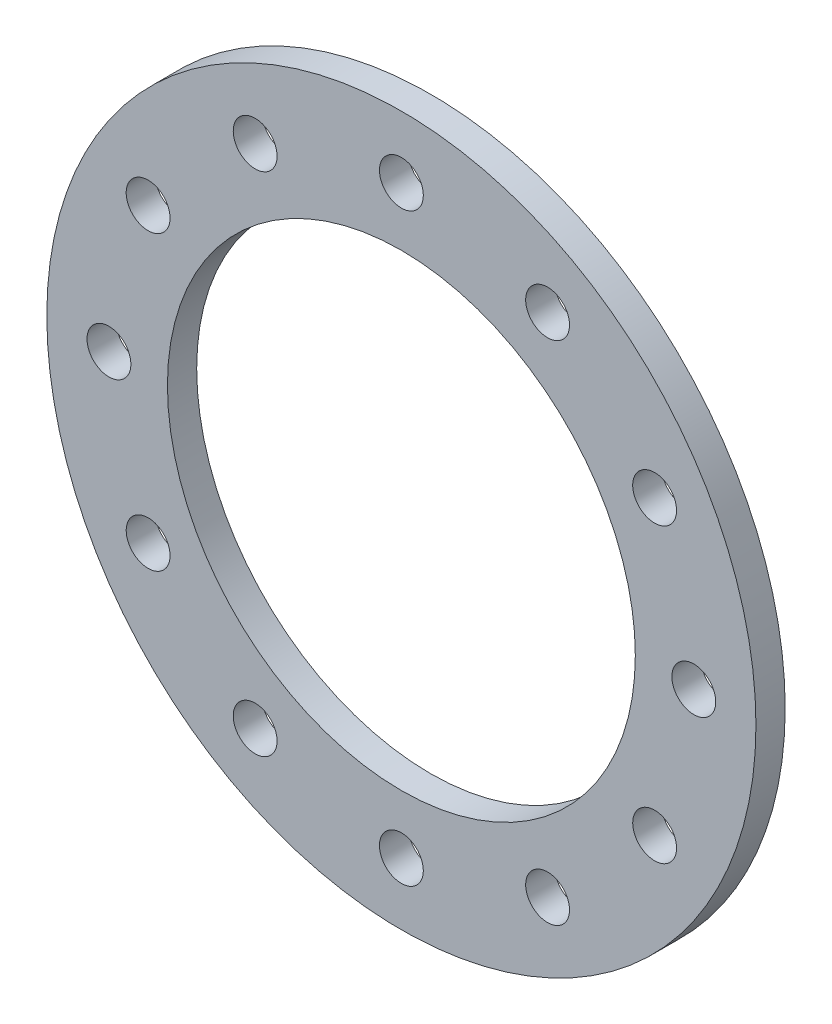
ISO-10303-21;
HEADER;
FILE_DESCRIPTION(('STEP AP214'),'2;1');
FILE_NAME('part.step','',(''),(''),'','','');
FILE_SCHEMA(('AUTOMOTIVE_DESIGN { 1 0 10303 214 1 1 1 1 }'));
ENDSEC;
DATA;
#1=APPLICATION_CONTEXT('core data for automotive mechanical design processes');
#2=APPLICATION_PROTOCOL_DEFINITION('international standard','automotive_design',2000,#1);
#3=PRODUCT_CONTEXT('',#1,'mechanical');
#4=PRODUCT('Part','Part','',(#3));
#5=PRODUCT_RELATED_PRODUCT_CATEGORY('part','',(#4));
#6=PRODUCT_DEFINITION_FORMATION('','',#4);
#7=PRODUCT_DEFINITION_CONTEXT('part definition',#1,'design');
#8=PRODUCT_DEFINITION('design','',#6,#7);
#9=PRODUCT_DEFINITION_SHAPE('','',#8);
#10=(LENGTH_UNIT() NAMED_UNIT(*) SI_UNIT(.MILLI.,.METRE.));
#11=(NAMED_UNIT(*) PLANE_ANGLE_UNIT() SI_UNIT($,.RADIAN.));
#12=(NAMED_UNIT(*) SI_UNIT($,.STERADIAN.) SOLID_ANGLE_UNIT());
#13=UNCERTAINTY_MEASURE_WITH_UNIT(LENGTH_MEASURE(1.E-05),#10,'distance_accuracy_value','');
#14=(GEOMETRIC_REPRESENTATION_CONTEXT(3) GLOBAL_UNCERTAINTY_ASSIGNED_CONTEXT((#13)) GLOBAL_UNIT_ASSIGNED_CONTEXT((#10,
#11,#12)) REPRESENTATION_CONTEXT('',''));
#15=CARTESIAN_POINT('',(0.,0.,0.));
#16=DIRECTION('',(0.,0.,1.));
#17=DIRECTION('',(1.,0.,0.));
#18=AXIS2_PLACEMENT_3D('',#15,#16,#17);
#19=CARTESIAN_POINT('',(0.,0.,4.));
#20=DIRECTION('',(0.,0.,1.));
#21=DIRECTION('',(1.,0.,0.));
#22=AXIS2_PLACEMENT_3D('',#19,#20,#21);
#23=PLANE('',#22);
#24=CARTESIAN_POINT('',(34.6410161513776,19.9999999999999,4.));
#25=DIRECTION('',(0.,0.,1.));
#26=DIRECTION('',(1.,0.,0.));
#27=AXIS2_PLACEMENT_3D('',#24,#25,#26);
#28=CIRCLE('',#27,3.);
#29=CARTESIAN_POINT('',(37.6410161513776,19.9999999999999,4.));
#30=VERTEX_POINT('',#29);
#31=EDGE_CURVE('E70',#30,#30,#28,.T.);
#32=ORIENTED_EDGE('',*,*,#31,.F.);
#33=EDGE_LOOP('',(#32));
#34=FACE_BOUND('',#33,.T.);
#35=CARTESIAN_POINT('',(40.,-1.39659253553725E-13,4.));
#36=DIRECTION('',(0.,0.,1.));
#37=DIRECTION('',(1.,0.,0.));
#38=AXIS2_PLACEMENT_3D('',#35,#36,#37);
#39=CIRCLE('',#38,3.);
#40=CARTESIAN_POINT('',(43.,-1.39659253553725E-13,4.));
#41=VERTEX_POINT('',#40);
#42=EDGE_CURVE('E74',#41,#41,#39,.T.);
#43=ORIENTED_EDGE('',*,*,#42,.F.);
#44=EDGE_LOOP('',(#43));
#45=FACE_BOUND('',#44,.T.);
#46=CARTESIAN_POINT('',(34.6410161513775,-20.0000000000002,4.));
#47=DIRECTION('',(0.,0.,1.));
#48=DIRECTION('',(1.,0.,0.));
#49=AXIS2_PLACEMENT_3D('',#46,#47,#48);
#50=CIRCLE('',#49,3.);
#51=CARTESIAN_POINT('',(37.6410161513775,-20.0000000000002,4.));
#52=VERTEX_POINT('',#51);
#53=EDGE_CURVE('E78',#52,#52,#50,.T.);
#54=ORIENTED_EDGE('',*,*,#53,.F.);
#55=EDGE_LOOP('',(#54));
#56=FACE_BOUND('',#55,.T.);
#57=CARTESIAN_POINT('',(19.9999999999998,-34.6410161513777,4.));
#58=DIRECTION('',(0.,0.,1.));
#59=DIRECTION('',(1.,0.,0.));
#60=AXIS2_PLACEMENT_3D('',#57,#58,#59);
#61=CIRCLE('',#60,3.);
#62=CARTESIAN_POINT('',(22.9999999999998,-34.6410161513777,4.));
#63=VERTEX_POINT('',#62);
#64=EDGE_CURVE('E82',#63,#63,#61,.T.);
#65=ORIENTED_EDGE('',*,*,#64,.F.);
#66=EDGE_LOOP('',(#65));
#67=FACE_BOUND('',#66,.T.);
#68=CARTESIAN_POINT('',(0.,-40.,4.));
#69=DIRECTION('',(0.,0.,1.));
#70=DIRECTION('',(1.,0.,0.));
#71=AXIS2_PLACEMENT_3D('',#68,#69,#70);
#72=CIRCLE('',#71,3.);
#73=CARTESIAN_POINT('',(3.,-40.,4.));
#74=VERTEX_POINT('',#73);
#75=EDGE_CURVE('E86',#74,#74,#72,.T.);
#76=ORIENTED_EDGE('',*,*,#75,.F.);
#77=EDGE_LOOP('',(#76));
#78=FACE_BOUND('',#77,.T.);
#79=CARTESIAN_POINT('',(-20.0000000000003,-34.6410161513774,4.));
#80=DIRECTION('',(0.,0.,1.));
#81=DIRECTION('',(1.,0.,0.));
#82=AXIS2_PLACEMENT_3D('',#79,#80,#81);
#83=CIRCLE('',#82,3.);
#84=CARTESIAN_POINT('',(-17.0000000000003,-34.6410161513774,4.));
#85=VERTEX_POINT('',#84);
#86=EDGE_CURVE('E90',#85,#85,#83,.T.);
#87=ORIENTED_EDGE('',*,*,#86,.F.);
#88=EDGE_LOOP('',(#87));
#89=FACE_BOUND('',#88,.T.);
#90=CARTESIAN_POINT('',(-34.6410161513777,-19.9999999999997,4.));
#91=DIRECTION('',(0.,0.,1.));
#92=DIRECTION('',(1.,0.,0.));
#93=AXIS2_PLACEMENT_3D('',#90,#91,#92);
#94=CIRCLE('',#93,3.);
#95=CARTESIAN_POINT('',(-31.6410161513777,-19.9999999999997,4.));
#96=VERTEX_POINT('',#95);
#97=EDGE_CURVE('E94',#96,#96,#94,.T.);
#98=ORIENTED_EDGE('',*,*,#97,.F.);
#99=EDGE_LOOP('',(#98));
#100=FACE_BOUND('',#99,.T.);
#101=CARTESIAN_POINT('',(-40.,4.18977760661176E-13,4.));
#102=DIRECTION('',(0.,0.,1.));
#103=DIRECTION('',(1.,0.,0.));
#104=AXIS2_PLACEMENT_3D('',#101,#102,#103);
#105=CIRCLE('',#104,3.);
#106=CARTESIAN_POINT('',(-37.,4.18977760661176E-13,4.));
#107=VERTEX_POINT('',#106);
#108=EDGE_CURVE('E98',#107,#107,#105,.T.);
#109=ORIENTED_EDGE('',*,*,#108,.F.);
#110=EDGE_LOOP('',(#109));
#111=FACE_BOUND('',#110,.T.);
#112=CARTESIAN_POINT('',(-34.6410161513773,20.0000000000004,4.));
#113=DIRECTION('',(0.,0.,1.));
#114=DIRECTION('',(1.,0.,0.));
#115=AXIS2_PLACEMENT_3D('',#112,#113,#114);
#116=CIRCLE('',#115,3.);
#117=CARTESIAN_POINT('',(-31.6410161513773,20.0000000000004,4.));
#118=VERTEX_POINT('',#117);
#119=EDGE_CURVE('E102',#118,#118,#116,.T.);
#120=ORIENTED_EDGE('',*,*,#119,.F.);
#121=EDGE_LOOP('',(#120));
#122=FACE_BOUND('',#121,.T.);
#123=CARTESIAN_POINT('',(-19.9999999999996,34.6410161513778,4.));
#124=DIRECTION('',(0.,0.,1.));
#125=DIRECTION('',(1.,0.,0.));
#126=AXIS2_PLACEMENT_3D('',#123,#124,#125);
#127=CIRCLE('',#126,3.);
#128=CARTESIAN_POINT('',(-16.9999999999996,34.6410161513778,4.));
#129=VERTEX_POINT('',#128);
#130=EDGE_CURVE('E106',#129,#129,#127,.T.);
#131=ORIENTED_EDGE('',*,*,#130,.F.);
#132=EDGE_LOOP('',(#131));
#133=FACE_BOUND('',#132,.T.);
#134=CARTESIAN_POINT('',(20.,34.6410161513775,4.));
#135=DIRECTION('',(0.,0.,1.));
#136=DIRECTION('',(1.,0.,0.));
#137=AXIS2_PLACEMENT_3D('',#134,#135,#136);
#138=CIRCLE('',#137,3.);
#139=CARTESIAN_POINT('',(23.,34.6410161513775,4.));
#140=VERTEX_POINT('',#139);
#141=EDGE_CURVE('E110',#140,#140,#138,.T.);
#142=ORIENTED_EDGE('',*,*,#141,.F.);
#143=EDGE_LOOP('',(#142));
#144=FACE_BOUND('',#143,.T.);
#145=CARTESIAN_POINT('',(0.,40.,4.));
#146=DIRECTION('',(0.,0.,1.));
#147=DIRECTION('',(1.,0.,0.));
#148=AXIS2_PLACEMENT_3D('',#145,#146,#147);
#149=CIRCLE('',#148,3.);
#150=CARTESIAN_POINT('',(3.,40.,4.));
#151=VERTEX_POINT('',#150);
#152=EDGE_CURVE('E59',#151,#151,#149,.T.);
#153=ORIENTED_EDGE('',*,*,#152,.F.);
#154=EDGE_LOOP('',(#153));
#155=FACE_BOUND('',#154,.T.);
#156=CARTESIAN_POINT('',(0.,0.,4.));
#157=DIRECTION('',(0.,0.,1.));
#158=DIRECTION('',(1.,0.,0.));
#159=AXIS2_PLACEMENT_3D('',#156,#157,#158);
#160=CIRCLE('',#159,48.5);
#161=CARTESIAN_POINT('',(48.5,0.,4.));
#162=VERTEX_POINT('',#161);
#163=EDGE_CURVE('E10',#162,#162,#160,.T.);
#164=ORIENTED_EDGE('',*,*,#163,.T.);
#165=EDGE_LOOP('',(#164));
#166=FACE_BOUND('',#165,.T.);
#167=CARTESIAN_POINT('',(0.,0.,4.));
#168=DIRECTION('',(0.,0.,1.));
#169=DIRECTION('',(1.,0.,0.));
#170=AXIS2_PLACEMENT_3D('',#167,#168,#169);
#171=CIRCLE('',#170,32.);
#172=CARTESIAN_POINT('',(32.,0.,4.));
#173=VERTEX_POINT('',#172);
#174=EDGE_CURVE('E53',#173,#173,#171,.T.);
#175=ORIENTED_EDGE('',*,*,#174,.F.);
#176=EDGE_LOOP('',(#175));
#177=FACE_BOUND('',#176,.T.);
#178=ADVANCED_FACE('F40',(#34,#45,#56,#67,#78,#89,#100,#111,#122,#133,#144,#155,#166,#177),#23,.T.);
#179=CARTESIAN_POINT('',(0.,0.,0.));
#180=DIRECTION('',(0.,0.,1.));
#181=DIRECTION('',(1.,0.,0.));
#182=AXIS2_PLACEMENT_3D('',#179,#180,#181);
#183=PLANE('',#182);
#184=CARTESIAN_POINT('',(34.6410161513776,19.9999999999999,0.));
#185=DIRECTION('',(0.,0.,-1.));
#186=DIRECTION('',(-0.499999999999998,0.86602540378444,0.));
#187=AXIS2_PLACEMENT_3D('',#184,#185,#186);
#188=CIRCLE('',#187,3.);
#189=CARTESIAN_POINT('',(33.1410161513776,22.5980762113532,0.));
#190=VERTEX_POINT('',#189);
#191=EDGE_CURVE('E118',#190,#190,#188,.T.);
#192=ORIENTED_EDGE('',*,*,#191,.F.);
#193=EDGE_LOOP('',(#192));
#194=FACE_BOUND('',#193,.T.);
#195=CARTESIAN_POINT('',(40.,-1.39659253553725E-13,0.));
#196=DIRECTION('',(0.,0.,-1.));
#197=DIRECTION('',(0.,1.,0.));
#198=AXIS2_PLACEMENT_3D('',#195,#196,#197);
#199=CIRCLE('',#198,3.);
#200=CARTESIAN_POINT('',(40.,2.99999999999986,0.));
#201=VERTEX_POINT('',#200);
#202=EDGE_CURVE('E144',#201,#201,#199,.T.);
#203=ORIENTED_EDGE('',*,*,#202,.F.);
#204=EDGE_LOOP('',(#203));
#205=FACE_BOUND('',#204,.T.);
#206=CARTESIAN_POINT('',(34.6410161513775,-20.0000000000002,0.));
#207=DIRECTION('',(0.,0.,-1.));
#208=DIRECTION('',(0.500000000000004,0.866025403784436,0.));
#209=AXIS2_PLACEMENT_3D('',#206,#207,#208);
#210=CIRCLE('',#209,3.);
#211=CARTESIAN_POINT('',(36.1410161513775,-17.4019237886469,0.));
#212=VERTEX_POINT('',#211);
#213=EDGE_CURVE('E140',#212,#212,#210,.T.);
#214=ORIENTED_EDGE('',*,*,#213,.F.);
#215=EDGE_LOOP('',(#214));
#216=FACE_BOUND('',#215,.T.);
#217=CARTESIAN_POINT('',(19.9999999999998,-34.6410161513777,0.));
#218=DIRECTION('',(0.,0.,-1.));
#219=DIRECTION('',(0.866025403784442,0.499999999999995,0.));
#220=AXIS2_PLACEMENT_3D('',#217,#218,#219);
#221=CIRCLE('',#220,3.);
#222=CARTESIAN_POINT('',(22.5980762113531,-33.1410161513777,0.));
#223=VERTEX_POINT('',#222);
#224=EDGE_CURVE('E136',#223,#223,#221,.T.);
#225=ORIENTED_EDGE('',*,*,#224,.F.);
#226=EDGE_LOOP('',(#225));
#227=FACE_BOUND('',#226,.T.);
#228=CARTESIAN_POINT('',(0.,-40.,0.));
#229=DIRECTION('',(0.,0.,-1.));
#230=DIRECTION('',(1.,0.,0.));
#231=AXIS2_PLACEMENT_3D('',#228,#229,#230);
#232=CIRCLE('',#231,3.);
#233=CARTESIAN_POINT('',(3.,-40.,0.));
#234=VERTEX_POINT('',#233);
#235=EDGE_CURVE('E132',#234,#234,#232,.T.);
#236=ORIENTED_EDGE('',*,*,#235,.F.);
#237=EDGE_LOOP('',(#236));
#238=FACE_BOUND('',#237,.T.);
#239=CARTESIAN_POINT('',(-20.0000000000003,-34.6410161513774,0.));
#240=DIRECTION('',(0.,0.,-1.));
#241=DIRECTION('',(0.866025403784435,-0.500000000000007,0.));
#242=AXIS2_PLACEMENT_3D('',#239,#240,#241);
#243=CIRCLE('',#242,3.);
#244=CARTESIAN_POINT('',(-17.401923788647,-36.1410161513774,0.));
#245=VERTEX_POINT('',#244);
#246=EDGE_CURVE('E128',#245,#245,#243,.T.);
#247=ORIENTED_EDGE('',*,*,#246,.F.);
#248=EDGE_LOOP('',(#247));
#249=FACE_BOUND('',#248,.T.);
#250=CARTESIAN_POINT('',(-34.6410161513777,-19.9999999999997,0.));
#251=DIRECTION('',(0.,0.,-1.));
#252=DIRECTION('',(0.499999999999992,-0.866025403784443,0.));
#253=AXIS2_PLACEMENT_3D('',#250,#251,#252);
#254=CIRCLE('',#253,3.);
#255=CARTESIAN_POINT('',(-33.1410161513778,-22.598076211353,0.));
#256=VERTEX_POINT('',#255);
#257=EDGE_CURVE('E123',#256,#256,#254,.T.);
#258=ORIENTED_EDGE('',*,*,#257,.F.);
#259=EDGE_LOOP('',(#258));
#260=FACE_BOUND('',#259,.T.);
#261=CARTESIAN_POINT('',(-40.,4.18977760661176E-13,0.));
#262=DIRECTION('',(0.,0.,-1.));
#263=DIRECTION('',(0.,-1.,0.));
#264=AXIS2_PLACEMENT_3D('',#261,#262,#263);
#265=CIRCLE('',#264,3.);
#266=CARTESIAN_POINT('',(-40.,-2.99999999999958,0.));
#267=VERTEX_POINT('',#266);
#268=EDGE_CURVE('E119',#267,#267,#265,.T.);
#269=ORIENTED_EDGE('',*,*,#268,.F.);
#270=EDGE_LOOP('',(#269));
#271=FACE_BOUND('',#270,.T.);
#272=CARTESIAN_POINT('',(-34.6410161513773,20.0000000000004,0.));
#273=DIRECTION('',(0.,0.,-1.));
#274=DIRECTION('',(-0.50000000000001,-0.866025403784433,0.));
#275=AXIS2_PLACEMENT_3D('',#272,#273,#274);
#276=CIRCLE('',#275,3.);
#277=CARTESIAN_POINT('',(-36.1410161513773,17.4019237886471,0.));
#278=VERTEX_POINT('',#277);
#279=EDGE_CURVE('E124',#278,#278,#276,.T.);
#280=ORIENTED_EDGE('',*,*,#279,.F.);
#281=EDGE_LOOP('',(#280));
#282=FACE_BOUND('',#281,.T.);
#283=CARTESIAN_POINT('',(-19.9999999999996,34.6410161513778,0.));
#284=DIRECTION('',(0.,0.,-1.));
#285=DIRECTION('',(-0.866025403784445,-0.499999999999989,0.));
#286=AXIS2_PLACEMENT_3D('',#283,#284,#285);
#287=CIRCLE('',#286,3.);
#288=CARTESIAN_POINT('',(-22.5980762113529,33.1410161513778,0.));
#289=VERTEX_POINT('',#288);
#290=EDGE_CURVE('E151',#289,#289,#287,.T.);
#291=ORIENTED_EDGE('',*,*,#290,.F.);
#292=EDGE_LOOP('',(#291));
#293=FACE_BOUND('',#292,.T.);
#294=CARTESIAN_POINT('',(20.,34.6410161513775,0.));
#295=DIRECTION('',(0.,0.,-1.));
#296=DIRECTION('',(-0.866025403784438,0.500000000000001,0.));
#297=AXIS2_PLACEMENT_3D('',#294,#295,#296);
#298=CIRCLE('',#297,3.);
#299=CARTESIAN_POINT('',(17.4019237886467,36.1410161513775,0.));
#300=VERTEX_POINT('',#299);
#301=EDGE_CURVE('E114',#300,#300,#298,.T.);
#302=ORIENTED_EDGE('',*,*,#301,.F.);
#303=EDGE_LOOP('',(#302));
#304=FACE_BOUND('',#303,.T.);
#305=CARTESIAN_POINT('',(0.,40.,0.));
#306=DIRECTION('',(0.,0.,-1.));
#307=DIRECTION('',(-1.,0.,0.));
#308=AXIS2_PLACEMENT_3D('',#305,#306,#307);
#309=CIRCLE('',#308,3.);
#310=CARTESIAN_POINT('',(-3.,40.,0.));
#311=VERTEX_POINT('',#310);
#312=EDGE_CURVE('E66',#311,#311,#309,.T.);
#313=ORIENTED_EDGE('',*,*,#312,.F.);
#314=EDGE_LOOP('',(#313));
#315=FACE_BOUND('',#314,.T.);
#316=CARTESIAN_POINT('',(0.,0.,0.));
#317=DIRECTION('',(0.,0.,1.));
#318=DIRECTION('',(1.,0.,0.));
#319=AXIS2_PLACEMENT_3D('',#316,#317,#318);
#320=CIRCLE('',#319,48.5);
#321=CARTESIAN_POINT('',(48.5,0.,0.));
#322=VERTEX_POINT('',#321);
#323=EDGE_CURVE('E44',#322,#322,#320,.T.);
#324=ORIENTED_EDGE('',*,*,#323,.F.);
#325=EDGE_LOOP('',(#324));
#326=FACE_BOUND('',#325,.T.);
#327=CARTESIAN_POINT('',(0.,0.,0.));
#328=DIRECTION('',(0.,0.,1.));
#329=DIRECTION('',(1.,0.,0.));
#330=AXIS2_PLACEMENT_3D('',#327,#328,#329);
#331=CIRCLE('',#330,32.);
#332=CARTESIAN_POINT('',(32.,0.,0.));
#333=VERTEX_POINT('',#332);
#334=EDGE_CURVE('E55',#333,#333,#331,.T.);
#335=ORIENTED_EDGE('',*,*,#334,.T.);
#336=EDGE_LOOP('',(#335));
#337=FACE_BOUND('',#336,.T.);
#338=ADVANCED_FACE('F161',(#194,#205,#216,#227,#238,#249,#260,#271,#282,#293,#304,#315,#326,
#337),#183,.F.);
#339=CARTESIAN_POINT('',(0.,0.,4.));
#340=DIRECTION('',(0.,0.,-1.));
#341=DIRECTION('',(-1.,0.,0.));
#342=AXIS2_PLACEMENT_3D('',#339,#340,#341);
#343=CYLINDRICAL_SURFACE('',#342,48.5);
#344=ORIENTED_EDGE('',*,*,#163,.F.);
#345=EDGE_LOOP('',(#344));
#346=FACE_BOUND('',#345,.T.);
#347=ORIENTED_EDGE('',*,*,#323,.T.);
#348=EDGE_LOOP('',(#347));
#349=FACE_BOUND('',#348,.T.);
#350=ADVANCED_FACE('F42',(#346,#349),#343,.T.);
#351=CARTESIAN_POINT('',(0.,0.,4.));
#352=DIRECTION('',(0.,0.,-1.));
#353=DIRECTION('',(-1.,0.,0.));
#354=AXIS2_PLACEMENT_3D('',#351,#352,#353);
#355=CYLINDRICAL_SURFACE('',#354,32.);
#356=ORIENTED_EDGE('',*,*,#174,.T.);
#357=EDGE_LOOP('',(#356));
#358=FACE_BOUND('',#357,.T.);
#359=ORIENTED_EDGE('',*,*,#334,.F.);
#360=EDGE_LOOP('',(#359));
#361=FACE_BOUND('',#360,.T.);
#362=ADVANCED_FACE('F175',(#358,#361),#355,.F.);
#363=CARTESIAN_POINT('',(0.,40.,18.6));
#364=DIRECTION('',(0.,0.,-1.));
#365=DIRECTION('',(-1.,0.,0.));
#366=AXIS2_PLACEMENT_3D('',#363,#364,#365);
#367=CYLINDRICAL_SURFACE('',#366,3.);
#368=ORIENTED_EDGE('',*,*,#152,.T.);
#369=EDGE_LOOP('',(#368));
#370=FACE_BOUND('',#369,.T.);
#371=ORIENTED_EDGE('',*,*,#312,.T.);
#372=EDGE_LOOP('',(#371));
#373=FACE_BOUND('',#372,.T.);
#374=ADVANCED_FACE('F177',(#370,#373),#367,.F.);
#375=CARTESIAN_POINT('',(20.,34.6410161513775,18.6));
#376=DIRECTION('',(0.,0.,-1.));
#377=DIRECTION('',(-1.,0.,0.));
#378=AXIS2_PLACEMENT_3D('',#375,#376,#377);
#379=CYLINDRICAL_SURFACE('',#378,3.);
#380=ORIENTED_EDGE('',*,*,#141,.T.);
#381=EDGE_LOOP('',(#380));
#382=FACE_BOUND('',#381,.T.);
#383=ORIENTED_EDGE('',*,*,#301,.T.);
#384=EDGE_LOOP('',(#383));
#385=FACE_BOUND('',#384,.T.);
#386=ADVANCED_FACE('F184',(#382,#385),#379,.F.);
#387=CARTESIAN_POINT('',(-19.9999999999996,34.6410161513778,18.6));
#388=DIRECTION('',(0.,0.,-1.));
#389=DIRECTION('',(-1.,0.,0.));
#390=AXIS2_PLACEMENT_3D('',#387,#388,#389);
#391=CYLINDRICAL_SURFACE('',#390,3.);
#392=ORIENTED_EDGE('',*,*,#130,.T.);
#393=EDGE_LOOP('',(#392));
#394=FACE_BOUND('',#393,.T.);
#395=ORIENTED_EDGE('',*,*,#290,.T.);
#396=EDGE_LOOP('',(#395));
#397=FACE_BOUND('',#396,.T.);
#398=ADVANCED_FACE('F223',(#394,#397),#391,.F.);
#399=CARTESIAN_POINT('',(-34.6410161513773,20.0000000000004,18.6));
#400=DIRECTION('',(0.,0.,-1.));
#401=DIRECTION('',(-1.,0.,0.));
#402=AXIS2_PLACEMENT_3D('',#399,#400,#401);
#403=CYLINDRICAL_SURFACE('',#402,3.);
#404=ORIENTED_EDGE('',*,*,#119,.T.);
#405=EDGE_LOOP('',(#404));
#406=FACE_BOUND('',#405,.T.);
#407=ORIENTED_EDGE('',*,*,#279,.T.);
#408=EDGE_LOOP('',(#407));
#409=FACE_BOUND('',#408,.T.);
#410=ADVANCED_FACE('F159',(#406,#409),#403,.F.);
#411=CARTESIAN_POINT('',(-40.,4.18977760661176E-13,18.6));
#412=DIRECTION('',(0.,0.,-1.));
#413=DIRECTION('',(-1.,0.,0.));
#414=AXIS2_PLACEMENT_3D('',#411,#412,#413);
#415=CYLINDRICAL_SURFACE('',#414,3.);
#416=ORIENTED_EDGE('',*,*,#108,.T.);
#417=EDGE_LOOP('',(#416));
#418=FACE_BOUND('',#417,.T.);
#419=ORIENTED_EDGE('',*,*,#268,.T.);
#420=EDGE_LOOP('',(#419));
#421=FACE_BOUND('',#420,.T.);
#422=ADVANCED_FACE('F231',(#418,#421),#415,.F.);
#423=CARTESIAN_POINT('',(-34.6410161513777,-19.9999999999997,18.6));
#424=DIRECTION('',(0.,0.,-1.));
#425=DIRECTION('',(-1.,0.,0.));
#426=AXIS2_PLACEMENT_3D('',#423,#424,#425);
#427=CYLINDRICAL_SURFACE('',#426,3.);
#428=ORIENTED_EDGE('',*,*,#97,.T.);
#429=EDGE_LOOP('',(#428));
#430=FACE_BOUND('',#429,.T.);
#431=ORIENTED_EDGE('',*,*,#257,.T.);
#432=EDGE_LOOP('',(#431));
#433=FACE_BOUND('',#432,.T.);
#434=ADVANCED_FACE('F234',(#430,#433),#427,.F.);
#435=CARTESIAN_POINT('',(-20.0000000000003,-34.6410161513774,18.6));
#436=DIRECTION('',(0.,0.,-1.));
#437=DIRECTION('',(-1.,0.,0.));
#438=AXIS2_PLACEMENT_3D('',#435,#436,#437);
#439=CYLINDRICAL_SURFACE('',#438,3.);
#440=ORIENTED_EDGE('',*,*,#86,.T.);
#441=EDGE_LOOP('',(#440));
#442=FACE_BOUND('',#441,.T.);
#443=ORIENTED_EDGE('',*,*,#246,.T.);
#444=EDGE_LOOP('',(#443));
#445=FACE_BOUND('',#444,.T.);
#446=ADVANCED_FACE('F238',(#442,#445),#439,.F.);
#447=CARTESIAN_POINT('',(0.,-40.,18.6));
#448=DIRECTION('',(0.,0.,-1.));
#449=DIRECTION('',(-1.,0.,0.));
#450=AXIS2_PLACEMENT_3D('',#447,#448,#449);
#451=CYLINDRICAL_SURFACE('',#450,3.);
#452=ORIENTED_EDGE('',*,*,#75,.T.);
#453=EDGE_LOOP('',(#452));
#454=FACE_BOUND('',#453,.T.);
#455=ORIENTED_EDGE('',*,*,#235,.T.);
#456=EDGE_LOOP('',(#455));
#457=FACE_BOUND('',#456,.T.);
#458=ADVANCED_FACE('F242',(#454,#457),#451,.F.);
#459=CARTESIAN_POINT('',(19.9999999999998,-34.6410161513777,18.6));
#460=DIRECTION('',(0.,0.,-1.));
#461=DIRECTION('',(-1.,0.,0.));
#462=AXIS2_PLACEMENT_3D('',#459,#460,#461);
#463=CYLINDRICAL_SURFACE('',#462,3.);
#464=ORIENTED_EDGE('',*,*,#64,.T.);
#465=EDGE_LOOP('',(#464));
#466=FACE_BOUND('',#465,.T.);
#467=ORIENTED_EDGE('',*,*,#224,.T.);
#468=EDGE_LOOP('',(#467));
#469=FACE_BOUND('',#468,.T.);
#470=ADVANCED_FACE('F246',(#466,#469),#463,.F.);
#471=CARTESIAN_POINT('',(34.6410161513775,-20.0000000000002,18.6));
#472=DIRECTION('',(0.,0.,-1.));
#473=DIRECTION('',(-1.,0.,0.));
#474=AXIS2_PLACEMENT_3D('',#471,#472,#473);
#475=CYLINDRICAL_SURFACE('',#474,3.);
#476=ORIENTED_EDGE('',*,*,#53,.T.);
#477=EDGE_LOOP('',(#476));
#478=FACE_BOUND('',#477,.T.);
#479=ORIENTED_EDGE('',*,*,#213,.T.);
#480=EDGE_LOOP('',(#479));
#481=FACE_BOUND('',#480,.T.);
#482=ADVANCED_FACE('F250',(#478,#481),#475,.F.);
#483=CARTESIAN_POINT('',(40.,-1.39659253553725E-13,18.6));
#484=DIRECTION('',(0.,0.,-1.));
#485=DIRECTION('',(-1.,0.,0.));
#486=AXIS2_PLACEMENT_3D('',#483,#484,#485);
#487=CYLINDRICAL_SURFACE('',#486,3.);
#488=ORIENTED_EDGE('',*,*,#42,.T.);
#489=EDGE_LOOP('',(#488));
#490=FACE_BOUND('',#489,.T.);
#491=ORIENTED_EDGE('',*,*,#202,.T.);
#492=EDGE_LOOP('',(#491));
#493=FACE_BOUND('',#492,.T.);
#494=ADVANCED_FACE('F254',(#490,#493),#487,.F.);
#495=CARTESIAN_POINT('',(34.6410161513776,19.9999999999999,18.6));
#496=DIRECTION('',(0.,0.,-1.));
#497=DIRECTION('',(-1.,0.,0.));
#498=AXIS2_PLACEMENT_3D('',#495,#496,#497);
#499=CYLINDRICAL_SURFACE('',#498,3.);
#500=ORIENTED_EDGE('',*,*,#31,.T.);
#501=EDGE_LOOP('',(#500));
#502=FACE_BOUND('',#501,.T.);
#503=ORIENTED_EDGE('',*,*,#191,.T.);
#504=EDGE_LOOP('',(#503));
#505=FACE_BOUND('',#504,.T.);
#506=ADVANCED_FACE('F258',(#502,#505),#499,.F.);
#507=CLOSED_SHELL('',(#178,#338,#350,#362,#374,#386,#398,#410,#422,#434,#446,#458,#470,#482,
#494,#506));
#508=MANIFOLD_SOLID_BREP('B2',#507);
#509=ADVANCED_BREP_SHAPE_REPRESENTATION('',(#18,#508),#14);
#510=SHAPE_DEFINITION_REPRESENTATION(#9,#509);
ENDSEC;
END-ISO-10303-21;
